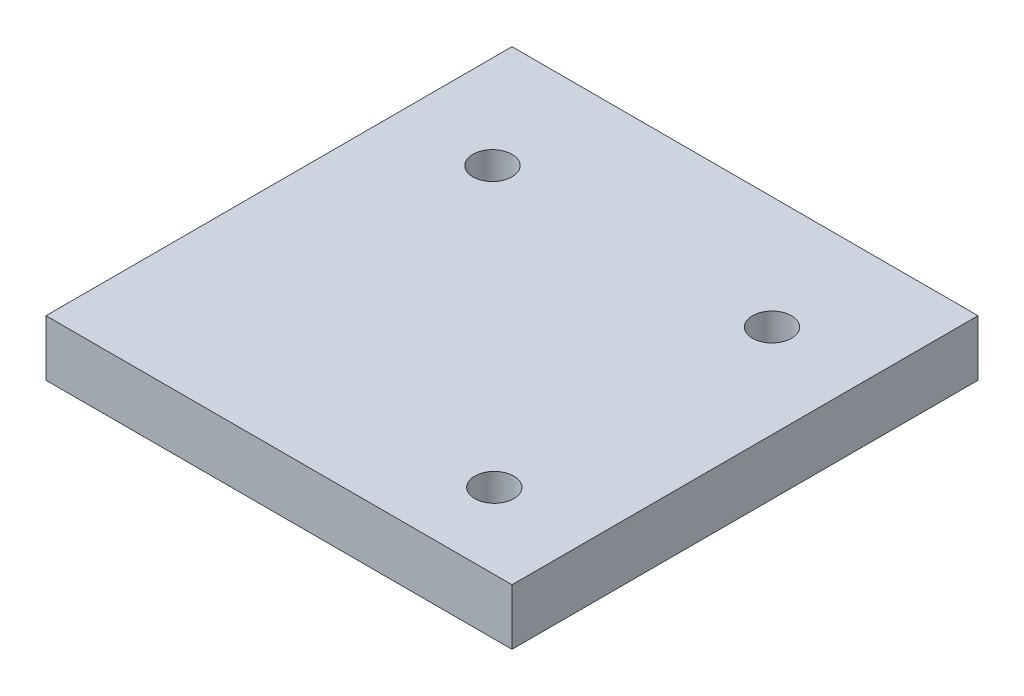
ISO-10303-21;
HEADER;
FILE_DESCRIPTION(('STEP AP214'),'2;1');
FILE_NAME('part.step','',(''),(''),'','','');
FILE_SCHEMA(('AUTOMOTIVE_DESIGN { 1 0 10303 214 1 1 1 1 }'));
ENDSEC;
DATA;
#1=APPLICATION_CONTEXT('core data for automotive mechanical design processes');
#2=APPLICATION_PROTOCOL_DEFINITION('international standard','automotive_design',2000,#1);
#3=PRODUCT_CONTEXT('',#1,'mechanical');
#4=PRODUCT('Part','Part','',(#3));
#5=PRODUCT_RELATED_PRODUCT_CATEGORY('part','',(#4));
#6=PRODUCT_DEFINITION_FORMATION('','',#4);
#7=PRODUCT_DEFINITION_CONTEXT('part definition',#1,'design');
#8=PRODUCT_DEFINITION('design','',#6,#7);
#9=PRODUCT_DEFINITION_SHAPE('','',#8);
#10=(LENGTH_UNIT() NAMED_UNIT(*) SI_UNIT(.MILLI.,.METRE.));
#11=(NAMED_UNIT(*) PLANE_ANGLE_UNIT() SI_UNIT($,.RADIAN.));
#12=(NAMED_UNIT(*) SI_UNIT($,.STERADIAN.) SOLID_ANGLE_UNIT());
#13=UNCERTAINTY_MEASURE_WITH_UNIT(LENGTH_MEASURE(1.E-05),#10,'distance_accuracy_value','');
#14=(GEOMETRIC_REPRESENTATION_CONTEXT(3) GLOBAL_UNCERTAINTY_ASSIGNED_CONTEXT((#13)) GLOBAL_UNIT_ASSIGNED_CONTEXT((#10,
#11,#12)) REPRESENTATION_CONTEXT('',''));
#15=CARTESIAN_POINT('',(0.,0.,0.));
#16=DIRECTION('',(0.,0.,1.));
#17=DIRECTION('',(1.,0.,0.));
#18=AXIS2_PLACEMENT_3D('',#15,#16,#17);
#19=CARTESIAN_POINT('',(25.,6.,25.));
#20=DIRECTION('',(-1.,0.,0.));
#21=DIRECTION('',(0.,0.,1.));
#22=AXIS2_PLACEMENT_3D('',#19,#20,#21);
#23=PLANE('',#22);
#24=DIRECTION('',(0.,0.,-1.));
#25=VECTOR('',#24,1.);
#26=CARTESIAN_POINT('',(25.,0.,25.));
#27=LINE('',#26,#25);
#28=CARTESIAN_POINT('',(25.,0.,25.));
#29=VERTEX_POINT('',#28);
#30=CARTESIAN_POINT('',(25.,0.,-25.));
#31=VERTEX_POINT('',#30);
#32=EDGE_CURVE('E102',#29,#31,#27,.T.);
#33=ORIENTED_EDGE('',*,*,#32,.T.);
#34=DIRECTION('',(0.,-1.,0.));
#35=VECTOR('',#34,1.);
#36=CARTESIAN_POINT('',(25.,6.,-25.));
#37=LINE('',#36,#35);
#38=CARTESIAN_POINT('',(25.,6.,-25.));
#39=VERTEX_POINT('',#38);
#40=EDGE_CURVE('E11',#39,#31,#37,.T.);
#41=ORIENTED_EDGE('',*,*,#40,.F.);
#42=DIRECTION('',(0.,0.,-1.));
#43=VECTOR('',#42,1.);
#44=CARTESIAN_POINT('',(25.,6.,25.));
#45=LINE('',#44,#43);
#46=CARTESIAN_POINT('',(25.,6.,25.));
#47=VERTEX_POINT('',#46);
#48=EDGE_CURVE('E90',#47,#39,#45,.T.);
#49=ORIENTED_EDGE('',*,*,#48,.F.);
#50=DIRECTION('',(0.,-1.,0.));
#51=VECTOR('',#50,1.);
#52=CARTESIAN_POINT('',(25.,6.,25.));
#53=LINE('',#52,#51);
#54=EDGE_CURVE('E98',#47,#29,#53,.T.);
#55=ORIENTED_EDGE('',*,*,#54,.T.);
#56=EDGE_LOOP('',(#33,#41,#49,#55));
#57=FACE_BOUND('',#56,.T.);
#58=ADVANCED_FACE('F39',(#57),#23,.F.);
#59=CARTESIAN_POINT('',(-25.,6.,-25.));
#60=DIRECTION('',(0.,0.,1.));
#61=DIRECTION('',(1.,0.,0.));
#62=AXIS2_PLACEMENT_3D('',#59,#60,#61);
#63=PLANE('',#62);
#64=DIRECTION('',(-1.,0.,0.));
#65=VECTOR('',#64,1.);
#66=CARTESIAN_POINT('',(-25.,0.,-25.));
#67=LINE('',#66,#65);
#68=CARTESIAN_POINT('',(-25.,0.,-25.));
#69=VERTEX_POINT('',#68);
#70=EDGE_CURVE('E94',#31,#69,#67,.T.);
#71=ORIENTED_EDGE('',*,*,#70,.T.);
#72=DIRECTION('',(0.,-1.,0.));
#73=VECTOR('',#72,1.);
#74=CARTESIAN_POINT('',(-25.,6.,-25.));
#75=LINE('',#74,#73);
#76=CARTESIAN_POINT('',(-25.,6.,-25.));
#77=VERTEX_POINT('',#76);
#78=EDGE_CURVE('E47',#77,#69,#75,.T.);
#79=ORIENTED_EDGE('',*,*,#78,.F.);
#80=DIRECTION('',(-1.,0.,0.));
#81=VECTOR('',#80,1.);
#82=CARTESIAN_POINT('',(-25.,6.,-25.));
#83=LINE('',#82,#81);
#84=EDGE_CURVE('E85',#39,#77,#83,.T.);
#85=ORIENTED_EDGE('',*,*,#84,.F.);
#86=ORIENTED_EDGE('',*,*,#40,.T.);
#87=EDGE_LOOP('',(#71,#79,#85,#86));
#88=FACE_BOUND('',#87,.T.);
#89=ADVANCED_FACE('F93',(#88),#63,.F.);
#90=CARTESIAN_POINT('',(-25.,6.,25.));
#91=DIRECTION('',(1.,0.,0.));
#92=DIRECTION('',(0.,0.,-1.));
#93=AXIS2_PLACEMENT_3D('',#90,#91,#92);
#94=PLANE('',#93);
#95=DIRECTION('',(0.,0.,1.));
#96=VECTOR('',#95,1.);
#97=CARTESIAN_POINT('',(-25.,0.,25.));
#98=LINE('',#97,#96);
#99=CARTESIAN_POINT('',(-25.,0.,25.));
#100=VERTEX_POINT('',#99);
#101=EDGE_CURVE('E72',#69,#100,#98,.T.);
#102=ORIENTED_EDGE('',*,*,#101,.T.);
#103=DIRECTION('',(0.,-1.,0.));
#104=VECTOR('',#103,1.);
#105=CARTESIAN_POINT('',(-25.,6.,25.));
#106=LINE('',#105,#104);
#107=CARTESIAN_POINT('',(-25.,6.,25.));
#108=VERTEX_POINT('',#107);
#109=EDGE_CURVE('E95',#108,#100,#106,.T.);
#110=ORIENTED_EDGE('',*,*,#109,.F.);
#111=DIRECTION('',(0.,0.,1.));
#112=VECTOR('',#111,1.);
#113=CARTESIAN_POINT('',(-25.,6.,25.));
#114=LINE('',#113,#112);
#115=EDGE_CURVE('E88',#77,#108,#114,.T.);
#116=ORIENTED_EDGE('',*,*,#115,.F.);
#117=ORIENTED_EDGE('',*,*,#78,.T.);
#118=EDGE_LOOP('',(#102,#110,#116,#117));
#119=FACE_BOUND('',#118,.T.);
#120=ADVANCED_FACE('F96',(#119),#94,.F.);
#121=CARTESIAN_POINT('',(-25.,6.,25.));
#122=DIRECTION('',(0.,0.,-1.));
#123=DIRECTION('',(-1.,0.,0.));
#124=AXIS2_PLACEMENT_3D('',#121,#122,#123);
#125=PLANE('',#124);
#126=DIRECTION('',(1.,0.,0.));
#127=VECTOR('',#126,1.);
#128=CARTESIAN_POINT('',(-25.,0.,25.));
#129=LINE('',#128,#127);
#130=EDGE_CURVE('E78',#100,#29,#129,.T.);
#131=ORIENTED_EDGE('',*,*,#130,.T.);
#132=ORIENTED_EDGE('',*,*,#54,.F.);
#133=DIRECTION('',(1.,0.,0.));
#134=VECTOR('',#133,1.);
#135=CARTESIAN_POINT('',(-25.,6.,25.));
#136=LINE('',#135,#134);
#137=EDGE_CURVE('E55',#108,#47,#136,.T.);
#138=ORIENTED_EDGE('',*,*,#137,.F.);
#139=ORIENTED_EDGE('',*,*,#109,.T.);
#140=EDGE_LOOP('',(#131,#132,#138,#139));
#141=FACE_BOUND('',#140,.T.);
#142=ADVANCED_FACE('F110',(#141),#125,.F.);
#143=CARTESIAN_POINT('',(0.,6.,0.));
#144=DIRECTION('',(0.,-1.,0.));
#145=DIRECTION('',(0.,0.,-1.));
#146=AXIS2_PLACEMENT_3D('',#143,#144,#145);
#147=PLANE('',#146);
#148=CARTESIAN_POINT('',(15.,6.,16.9));
#149=DIRECTION('',(0.,1.,0.));
#150=DIRECTION('',(0.,0.,1.));
#151=AXIS2_PLACEMENT_3D('',#148,#149,#150);
#152=CIRCLE('',#151,2.1);
#153=CARTESIAN_POINT('',(15.,6.,19.));
#154=VERTEX_POINT('',#153);
#155=EDGE_CURVE('E120',#154,#154,#152,.T.);
#156=ORIENTED_EDGE('',*,*,#155,.F.);
#157=EDGE_LOOP('',(#156));
#158=FACE_BOUND('',#157,.T.);
#159=CARTESIAN_POINT('',(-15.,6.,-12.9));
#160=DIRECTION('',(0.,1.,0.));
#161=DIRECTION('',(0.,0.,1.));
#162=AXIS2_PLACEMENT_3D('',#159,#160,#161);
#163=CIRCLE('',#162,2.1);
#164=CARTESIAN_POINT('',(-15.,6.,-10.8));
#165=VERTEX_POINT('',#164);
#166=EDGE_CURVE('E105',#165,#165,#163,.T.);
#167=ORIENTED_EDGE('',*,*,#166,.F.);
#168=EDGE_LOOP('',(#167));
#169=FACE_BOUND('',#168,.T.);
#170=CARTESIAN_POINT('',(15.,6.,-12.9));
#171=DIRECTION('',(0.,1.,0.));
#172=DIRECTION('',(0.,0.,1.));
#173=AXIS2_PLACEMENT_3D('',#170,#171,#172);
#174=CIRCLE('',#173,2.1);
#175=CARTESIAN_POINT('',(15.,6.,-10.8));
#176=VERTEX_POINT('',#175);
#177=EDGE_CURVE('E116',#176,#176,#174,.T.);
#178=ORIENTED_EDGE('',*,*,#177,.F.);
#179=EDGE_LOOP('',(#178));
#180=FACE_BOUND('',#179,.T.);
#181=ORIENTED_EDGE('',*,*,#48,.T.);
#182=ORIENTED_EDGE('',*,*,#84,.T.);
#183=ORIENTED_EDGE('',*,*,#115,.T.);
#184=ORIENTED_EDGE('',*,*,#137,.T.);
#185=EDGE_LOOP('',(#181,#182,#183,#184));
#186=FACE_BOUND('',#185,.T.);
#187=ADVANCED_FACE('F86',(#158,#169,#180,#186),#147,.F.);
#188=CARTESIAN_POINT('',(0.,0.,0.));
#189=DIRECTION('',(0.,-1.,0.));
#190=DIRECTION('',(0.,0.,-1.));
#191=AXIS2_PLACEMENT_3D('',#188,#189,#190);
#192=PLANE('',#191);
#193=CARTESIAN_POINT('',(15.,0.,16.9));
#194=DIRECTION('',(0.,-1.,0.));
#195=DIRECTION('',(0.,0.,-1.));
#196=AXIS2_PLACEMENT_3D('',#193,#194,#195);
#197=CIRCLE('',#196,2.1);
#198=CARTESIAN_POINT('',(15.,0.,19.));
#199=VERTEX_POINT('',#198);
#200=EDGE_CURVE('E128',#199,#199,#197,.F.);
#201=ORIENTED_EDGE('',*,*,#200,.T.);
#202=EDGE_LOOP('',(#201));
#203=FACE_BOUND('',#202,.T.);
#204=CARTESIAN_POINT('',(-15.,0.,-12.9));
#205=DIRECTION('',(0.,-1.,0.));
#206=DIRECTION('',(0.,0.,-1.));
#207=AXIS2_PLACEMENT_3D('',#204,#205,#206);
#208=CIRCLE('',#207,2.1);
#209=CARTESIAN_POINT('',(-15.,0.,-10.8));
#210=VERTEX_POINT('',#209);
#211=EDGE_CURVE('E123',#210,#210,#208,.F.);
#212=ORIENTED_EDGE('',*,*,#211,.T.);
#213=EDGE_LOOP('',(#212));
#214=FACE_BOUND('',#213,.T.);
#215=CARTESIAN_POINT('',(15.,0.,-12.9));
#216=DIRECTION('',(0.,-1.,0.));
#217=DIRECTION('',(0.,0.,-1.));
#218=AXIS2_PLACEMENT_3D('',#215,#216,#217);
#219=CIRCLE('',#218,2.1);
#220=CARTESIAN_POINT('',(15.,0.,-10.8));
#221=VERTEX_POINT('',#220);
#222=EDGE_CURVE('E119',#221,#221,#219,.F.);
#223=ORIENTED_EDGE('',*,*,#222,.T.);
#224=EDGE_LOOP('',(#223));
#225=FACE_BOUND('',#224,.T.);
#226=ORIENTED_EDGE('',*,*,#32,.F.);
#227=ORIENTED_EDGE('',*,*,#130,.F.);
#228=ORIENTED_EDGE('',*,*,#101,.F.);
#229=ORIENTED_EDGE('',*,*,#70,.F.);
#230=EDGE_LOOP('',(#226,#227,#228,#229));
#231=FACE_BOUND('',#230,.T.);
#232=ADVANCED_FACE('F113',(#203,#214,#225,#231),#192,.T.);
#233=CARTESIAN_POINT('',(15.,-0.00100000000000013,-12.9));
#234=DIRECTION('',(0.,1.,0.));
#235=DIRECTION('',(0.,0.,1.));
#236=AXIS2_PLACEMENT_3D('',#233,#234,#235);
#237=CYLINDRICAL_SURFACE('',#236,2.1);
#238=CARTESIAN_POINT('',(15.,0.,-10.8));
#239=CARTESIAN_POINT('',(15.,0.0624999999999999,-10.8));
#240=CARTESIAN_POINT('',(15.,0.125,-10.8));
#241=CARTESIAN_POINT('',(15.,0.25,-10.8));
#242=CARTESIAN_POINT('',(15.,0.3125,-10.8));
#243=CARTESIAN_POINT('',(15.,0.4375,-10.8));
#244=CARTESIAN_POINT('',(15.,0.5,-10.8));
#245=CARTESIAN_POINT('',(15.,0.625,-10.8));
#246=CARTESIAN_POINT('',(15.,0.6875,-10.8));
#247=CARTESIAN_POINT('',(15.,0.8125,-10.8));
#248=CARTESIAN_POINT('',(15.,0.875,-10.8));
#249=CARTESIAN_POINT('',(15.,1.,-10.8));
#250=CARTESIAN_POINT('',(15.,1.0625,-10.8));
#251=CARTESIAN_POINT('',(15.,1.1875,-10.8));
#252=CARTESIAN_POINT('',(15.,1.25,-10.8));
#253=CARTESIAN_POINT('',(15.,1.375,-10.8));
#254=CARTESIAN_POINT('',(15.,1.4375,-10.8));
#255=CARTESIAN_POINT('',(15.,1.5625,-10.8));
#256=CARTESIAN_POINT('',(15.,1.625,-10.8));
#257=CARTESIAN_POINT('',(15.,1.75,-10.8));
#258=CARTESIAN_POINT('',(15.,1.8125,-10.8));
#259=CARTESIAN_POINT('',(15.,1.9375,-10.8));
#260=CARTESIAN_POINT('',(15.,2.,-10.8));
#261=CARTESIAN_POINT('',(15.,2.125,-10.8));
#262=CARTESIAN_POINT('',(15.,2.1875,-10.8));
#263=CARTESIAN_POINT('',(15.,2.3125,-10.8));
#264=CARTESIAN_POINT('',(15.,2.375,-10.8));
#265=CARTESIAN_POINT('',(15.,2.5,-10.8));
#266=CARTESIAN_POINT('',(15.,2.5625,-10.8));
#267=CARTESIAN_POINT('',(15.,2.6875,-10.8));
#268=CARTESIAN_POINT('',(15.,2.75,-10.8));
#269=CARTESIAN_POINT('',(15.,2.875,-10.8));
#270=CARTESIAN_POINT('',(15.,2.9375,-10.8));
#271=CARTESIAN_POINT('',(15.,3.0625,-10.8));
#272=CARTESIAN_POINT('',(15.,3.125,-10.8));
#273=CARTESIAN_POINT('',(15.,3.25,-10.8));
#274=CARTESIAN_POINT('',(15.,3.3125,-10.8));
#275=CARTESIAN_POINT('',(15.,3.4375,-10.8));
#276=CARTESIAN_POINT('',(15.,3.5,-10.8));
#277=CARTESIAN_POINT('',(15.,3.625,-10.8));
#278=CARTESIAN_POINT('',(15.,3.6875,-10.8));
#279=CARTESIAN_POINT('',(15.,3.8125,-10.8));
#280=CARTESIAN_POINT('',(15.,3.875,-10.8));
#281=CARTESIAN_POINT('',(15.,4.,-10.8));
#282=CARTESIAN_POINT('',(15.,4.0625,-10.8));
#283=CARTESIAN_POINT('',(15.,4.1875,-10.8));
#284=CARTESIAN_POINT('',(15.,4.25,-10.8));
#285=CARTESIAN_POINT('',(15.,4.375,-10.8));
#286=CARTESIAN_POINT('',(15.,4.4375,-10.8));
#287=CARTESIAN_POINT('',(15.,4.5625,-10.8));
#288=CARTESIAN_POINT('',(15.,4.625,-10.8));
#289=CARTESIAN_POINT('',(15.,4.75,-10.8));
#290=CARTESIAN_POINT('',(15.,4.8125,-10.8));
#291=CARTESIAN_POINT('',(15.,4.9375,-10.8));
#292=CARTESIAN_POINT('',(15.,5.,-10.8));
#293=CARTESIAN_POINT('',(15.,5.125,-10.8));
#294=CARTESIAN_POINT('',(15.,5.1875,-10.8));
#295=CARTESIAN_POINT('',(15.,5.3125,-10.8));
#296=CARTESIAN_POINT('',(15.,5.375,-10.8));
#297=CARTESIAN_POINT('',(15.,5.5,-10.8));
#298=CARTESIAN_POINT('',(15.,5.5625,-10.8));
#299=CARTESIAN_POINT('',(15.,5.6875,-10.8));
#300=CARTESIAN_POINT('',(15.,5.75,-10.8));
#301=CARTESIAN_POINT('',(15.,5.875,-10.8));
#302=CARTESIAN_POINT('',(15.,5.9375,-10.8));
#303=CARTESIAN_POINT('',(15.,6.,-10.8));
#304=B_SPLINE_CURVE_WITH_KNOTS('',3,(#238,#239,#240,#241,#242,#243,#244,#245,#246,#247,#248,
#249,#250,#251,#252,#253,#254,#255,#256,#257,#258,#259,#260,#261,#262,#263,#264,#265,#266,#267,
#268,#269,#270,#271,#272,#273,#274,#275,#276,#277,#278,#279,#280,#281,#282,#283,#284,#285,#286,
#287,#288,#289,#290,#291,#292,#293,#294,#295,#296,#297,#298,#299,#300,#301,#302,#303),
.UNSPECIFIED.,.F.,.F.,(4,2,2,2,2,2,2,2,2,2,2,2,2,2,2,2,2,2,2,2,2,2,2,2,2,2,2,2,2,2,2,2,4),(0.,
0.1875,0.375,0.5625,0.75,0.9375,1.125,1.3125,1.5,1.6875,1.875,2.0625,2.25,2.4375,2.625,2.8125,
3.,3.1875,3.375,3.5625,3.75,3.9375,4.125,4.3125,4.5,4.6875,4.875,5.0625,5.25,5.4375,5.625,
5.8125,6.),.UNSPECIFIED.);
#305=EDGE_CURVE('BSEAM143',#221,#176,#304,.T.);
#306=ORIENTED_EDGE('',*,*,#222,.F.);
#307=ORIENTED_EDGE('',*,*,#177,.T.);
#308=ORIENTED_EDGE('',*,*,#305,.T.);
#309=ORIENTED_EDGE('',*,*,#305,.F.);
#310=EDGE_LOOP('',(#306,#308,#307,#309));
#311=FACE_BOUND('',#310,.T.);
#312=ADVANCED_FACE('F143',(#311),#237,.F.);
#313=CARTESIAN_POINT('',(-15.,-0.00100000000000013,-12.9));
#314=DIRECTION('',(0.,1.,0.));
#315=DIRECTION('',(0.,0.,1.));
#316=AXIS2_PLACEMENT_3D('',#313,#314,#315);
#317=CYLINDRICAL_SURFACE('',#316,2.1);
#318=CARTESIAN_POINT('',(-15.,0.,-10.8));
#319=CARTESIAN_POINT('',(-15.,0.0624999999999999,-10.8));
#320=CARTESIAN_POINT('',(-15.,0.125,-10.8));
#321=CARTESIAN_POINT('',(-15.,0.25,-10.8));
#322=CARTESIAN_POINT('',(-15.,0.3125,-10.8));
#323=CARTESIAN_POINT('',(-15.,0.4375,-10.8));
#324=CARTESIAN_POINT('',(-15.,0.5,-10.8));
#325=CARTESIAN_POINT('',(-15.,0.625,-10.8));
#326=CARTESIAN_POINT('',(-15.,0.6875,-10.8));
#327=CARTESIAN_POINT('',(-15.,0.8125,-10.8));
#328=CARTESIAN_POINT('',(-15.,0.875,-10.8));
#329=CARTESIAN_POINT('',(-15.,1.,-10.8));
#330=CARTESIAN_POINT('',(-15.,1.0625,-10.8));
#331=CARTESIAN_POINT('',(-15.,1.1875,-10.8));
#332=CARTESIAN_POINT('',(-15.,1.25,-10.8));
#333=CARTESIAN_POINT('',(-15.,1.375,-10.8));
#334=CARTESIAN_POINT('',(-15.,1.4375,-10.8));
#335=CARTESIAN_POINT('',(-15.,1.5625,-10.8));
#336=CARTESIAN_POINT('',(-15.,1.625,-10.8));
#337=CARTESIAN_POINT('',(-15.,1.75,-10.8));
#338=CARTESIAN_POINT('',(-15.,1.8125,-10.8));
#339=CARTESIAN_POINT('',(-15.,1.9375,-10.8));
#340=CARTESIAN_POINT('',(-15.,2.,-10.8));
#341=CARTESIAN_POINT('',(-15.,2.125,-10.8));
#342=CARTESIAN_POINT('',(-15.,2.1875,-10.8));
#343=CARTESIAN_POINT('',(-15.,2.3125,-10.8));
#344=CARTESIAN_POINT('',(-15.,2.375,-10.8));
#345=CARTESIAN_POINT('',(-15.,2.5,-10.8));
#346=CARTESIAN_POINT('',(-15.,2.5625,-10.8));
#347=CARTESIAN_POINT('',(-15.,2.6875,-10.8));
#348=CARTESIAN_POINT('',(-15.,2.75,-10.8));
#349=CARTESIAN_POINT('',(-15.,2.875,-10.8));
#350=CARTESIAN_POINT('',(-15.,2.9375,-10.8));
#351=CARTESIAN_POINT('',(-15.,3.0625,-10.8));
#352=CARTESIAN_POINT('',(-15.,3.125,-10.8));
#353=CARTESIAN_POINT('',(-15.,3.25,-10.8));
#354=CARTESIAN_POINT('',(-15.,3.3125,-10.8));
#355=CARTESIAN_POINT('',(-15.,3.4375,-10.8));
#356=CARTESIAN_POINT('',(-15.,3.5,-10.8));
#357=CARTESIAN_POINT('',(-15.,3.625,-10.8));
#358=CARTESIAN_POINT('',(-15.,3.6875,-10.8));
#359=CARTESIAN_POINT('',(-15.,3.8125,-10.8));
#360=CARTESIAN_POINT('',(-15.,3.875,-10.8));
#361=CARTESIAN_POINT('',(-15.,4.,-10.8));
#362=CARTESIAN_POINT('',(-15.,4.0625,-10.8));
#363=CARTESIAN_POINT('',(-15.,4.1875,-10.8));
#364=CARTESIAN_POINT('',(-15.,4.25,-10.8));
#365=CARTESIAN_POINT('',(-15.,4.375,-10.8));
#366=CARTESIAN_POINT('',(-15.,4.4375,-10.8));
#367=CARTESIAN_POINT('',(-15.,4.5625,-10.8));
#368=CARTESIAN_POINT('',(-15.,4.625,-10.8));
#369=CARTESIAN_POINT('',(-15.,4.75,-10.8));
#370=CARTESIAN_POINT('',(-15.,4.8125,-10.8));
#371=CARTESIAN_POINT('',(-15.,4.9375,-10.8));
#372=CARTESIAN_POINT('',(-15.,5.,-10.8));
#373=CARTESIAN_POINT('',(-15.,5.125,-10.8));
#374=CARTESIAN_POINT('',(-15.,5.1875,-10.8));
#375=CARTESIAN_POINT('',(-15.,5.3125,-10.8));
#376=CARTESIAN_POINT('',(-15.,5.375,-10.8));
#377=CARTESIAN_POINT('',(-15.,5.5,-10.8));
#378=CARTESIAN_POINT('',(-15.,5.5625,-10.8));
#379=CARTESIAN_POINT('',(-15.,5.6875,-10.8));
#380=CARTESIAN_POINT('',(-15.,5.75,-10.8));
#381=CARTESIAN_POINT('',(-15.,5.875,-10.8));
#382=CARTESIAN_POINT('',(-15.,5.9375,-10.8));
#383=CARTESIAN_POINT('',(-15.,6.,-10.8));
#384=B_SPLINE_CURVE_WITH_KNOTS('',3,(#318,#319,#320,#321,#322,#323,#324,#325,#326,#327,#328,
#329,#330,#331,#332,#333,#334,#335,#336,#337,#338,#339,#340,#341,#342,#343,#344,#345,#346,#347,
#348,#349,#350,#351,#352,#353,#354,#355,#356,#357,#358,#359,#360,#361,#362,#363,#364,#365,#366,
#367,#368,#369,#370,#371,#372,#373,#374,#375,#376,#377,#378,#379,#380,#381,#382,#383),
.UNSPECIFIED.,.F.,.F.,(4,2,2,2,2,2,2,2,2,2,2,2,2,2,2,2,2,2,2,2,2,2,2,2,2,2,2,2,2,2,2,2,4),(0.,
0.1875,0.375,0.5625,0.75,0.9375,1.125,1.3125,1.5,1.6875,1.875,2.0625,2.25,2.4375,2.625,2.8125,
3.,3.1875,3.375,3.5625,3.75,3.9375,4.125,4.3125,4.5,4.6875,4.875,5.0625,5.25,5.4375,5.625,
5.8125,6.),.UNSPECIFIED.);
#385=EDGE_CURVE('BSEAM145',#210,#165,#384,.T.);
#386=ORIENTED_EDGE('',*,*,#211,.F.);
#387=ORIENTED_EDGE('',*,*,#166,.T.);
#388=ORIENTED_EDGE('',*,*,#385,.T.);
#389=ORIENTED_EDGE('',*,*,#385,.F.);
#390=EDGE_LOOP('',(#386,#388,#387,#389));
#391=FACE_BOUND('',#390,.T.);
#392=ADVANCED_FACE('F145',(#391),#317,.F.);
#393=CARTESIAN_POINT('',(15.,-0.00100000000000013,16.9));
#394=DIRECTION('',(0.,1.,0.));
#395=DIRECTION('',(0.,0.,1.));
#396=AXIS2_PLACEMENT_3D('',#393,#394,#395);
#397=CYLINDRICAL_SURFACE('',#396,2.1);
#398=CARTESIAN_POINT('',(15.,0.,19.));
#399=CARTESIAN_POINT('',(15.,0.0624999999999999,19.));
#400=CARTESIAN_POINT('',(15.,0.125,19.));
#401=CARTESIAN_POINT('',(15.,0.25,19.));
#402=CARTESIAN_POINT('',(15.,0.3125,19.));
#403=CARTESIAN_POINT('',(15.,0.4375,19.));
#404=CARTESIAN_POINT('',(15.,0.5,19.));
#405=CARTESIAN_POINT('',(15.,0.625,19.));
#406=CARTESIAN_POINT('',(15.,0.6875,19.));
#407=CARTESIAN_POINT('',(15.,0.8125,19.));
#408=CARTESIAN_POINT('',(15.,0.875,19.));
#409=CARTESIAN_POINT('',(15.,1.,19.));
#410=CARTESIAN_POINT('',(15.,1.0625,19.));
#411=CARTESIAN_POINT('',(15.,1.1875,19.));
#412=CARTESIAN_POINT('',(15.,1.25,19.));
#413=CARTESIAN_POINT('',(15.,1.375,19.));
#414=CARTESIAN_POINT('',(15.,1.4375,19.));
#415=CARTESIAN_POINT('',(15.,1.5625,19.));
#416=CARTESIAN_POINT('',(15.,1.625,19.));
#417=CARTESIAN_POINT('',(15.,1.75,19.));
#418=CARTESIAN_POINT('',(15.,1.8125,19.));
#419=CARTESIAN_POINT('',(15.,1.9375,19.));
#420=CARTESIAN_POINT('',(15.,2.,19.));
#421=CARTESIAN_POINT('',(15.,2.125,19.));
#422=CARTESIAN_POINT('',(15.,2.1875,19.));
#423=CARTESIAN_POINT('',(15.,2.3125,19.));
#424=CARTESIAN_POINT('',(15.,2.375,19.));
#425=CARTESIAN_POINT('',(15.,2.5,19.));
#426=CARTESIAN_POINT('',(15.,2.5625,19.));
#427=CARTESIAN_POINT('',(15.,2.6875,19.));
#428=CARTESIAN_POINT('',(15.,2.75,19.));
#429=CARTESIAN_POINT('',(15.,2.875,19.));
#430=CARTESIAN_POINT('',(15.,2.9375,19.));
#431=CARTESIAN_POINT('',(15.,3.0625,19.));
#432=CARTESIAN_POINT('',(15.,3.125,19.));
#433=CARTESIAN_POINT('',(15.,3.25,19.));
#434=CARTESIAN_POINT('',(15.,3.3125,19.));
#435=CARTESIAN_POINT('',(15.,3.4375,19.));
#436=CARTESIAN_POINT('',(15.,3.5,19.));
#437=CARTESIAN_POINT('',(15.,3.625,19.));
#438=CARTESIAN_POINT('',(15.,3.6875,19.));
#439=CARTESIAN_POINT('',(15.,3.8125,19.));
#440=CARTESIAN_POINT('',(15.,3.875,19.));
#441=CARTESIAN_POINT('',(15.,4.,19.));
#442=CARTESIAN_POINT('',(15.,4.0625,19.));
#443=CARTESIAN_POINT('',(15.,4.1875,19.));
#444=CARTESIAN_POINT('',(15.,4.25,19.));
#445=CARTESIAN_POINT('',(15.,4.375,19.));
#446=CARTESIAN_POINT('',(15.,4.4375,19.));
#447=CARTESIAN_POINT('',(15.,4.5625,19.));
#448=CARTESIAN_POINT('',(15.,4.625,19.));
#449=CARTESIAN_POINT('',(15.,4.75,19.));
#450=CARTESIAN_POINT('',(15.,4.8125,19.));
#451=CARTESIAN_POINT('',(15.,4.9375,19.));
#452=CARTESIAN_POINT('',(15.,5.,19.));
#453=CARTESIAN_POINT('',(15.,5.125,19.));
#454=CARTESIAN_POINT('',(15.,5.1875,19.));
#455=CARTESIAN_POINT('',(15.,5.3125,19.));
#456=CARTESIAN_POINT('',(15.,5.375,19.));
#457=CARTESIAN_POINT('',(15.,5.5,19.));
#458=CARTESIAN_POINT('',(15.,5.5625,19.));
#459=CARTESIAN_POINT('',(15.,5.6875,19.));
#460=CARTESIAN_POINT('',(15.,5.75,19.));
#461=CARTESIAN_POINT('',(15.,5.875,19.));
#462=CARTESIAN_POINT('',(15.,5.9375,19.));
#463=CARTESIAN_POINT('',(15.,6.,19.));
#464=B_SPLINE_CURVE_WITH_KNOTS('',3,(#398,#399,#400,#401,#402,#403,#404,#405,#406,#407,#408,
#409,#410,#411,#412,#413,#414,#415,#416,#417,#418,#419,#420,#421,#422,#423,#424,#425,#426,#427,
#428,#429,#430,#431,#432,#433,#434,#435,#436,#437,#438,#439,#440,#441,#442,#443,#444,#445,#446,
#447,#448,#449,#450,#451,#452,#453,#454,#455,#456,#457,#458,#459,#460,#461,#462,#463),
.UNSPECIFIED.,.F.,.F.,(4,2,2,2,2,2,2,2,2,2,2,2,2,2,2,2,2,2,2,2,2,2,2,2,2,2,2,2,2,2,2,2,4),(0.,
0.1875,0.375,0.5625,0.75,0.9375,1.125,1.3125,1.5,1.6875,1.875,2.0625,2.25,2.4375,2.625,2.8125,
3.,3.1875,3.375,3.5625,3.75,3.9375,4.125,4.3125,4.5,4.6875,4.875,5.0625,5.25,5.4375,5.625,
5.8125,6.),.UNSPECIFIED.);
#465=EDGE_CURVE('BSEAM134',#199,#154,#464,.T.);
#466=ORIENTED_EDGE('',*,*,#200,.F.);
#467=ORIENTED_EDGE('',*,*,#155,.T.);
#468=ORIENTED_EDGE('',*,*,#465,.T.);
#469=ORIENTED_EDGE('',*,*,#465,.F.);
#470=EDGE_LOOP('',(#466,#468,#467,#469));
#471=FACE_BOUND('',#470,.T.);
#472=ADVANCED_FACE('F134',(#471),#397,.F.);
#473=CLOSED_SHELL('',(#58,#89,#120,#142,#187,#232,#312,#392,#472));
#474=MANIFOLD_SOLID_BREP('B2',#473);
#475=ADVANCED_BREP_SHAPE_REPRESENTATION('',(#18,#474),#14);
#476=SHAPE_DEFINITION_REPRESENTATION(#9,#475);
ENDSEC;
END-ISO-10303-21;
